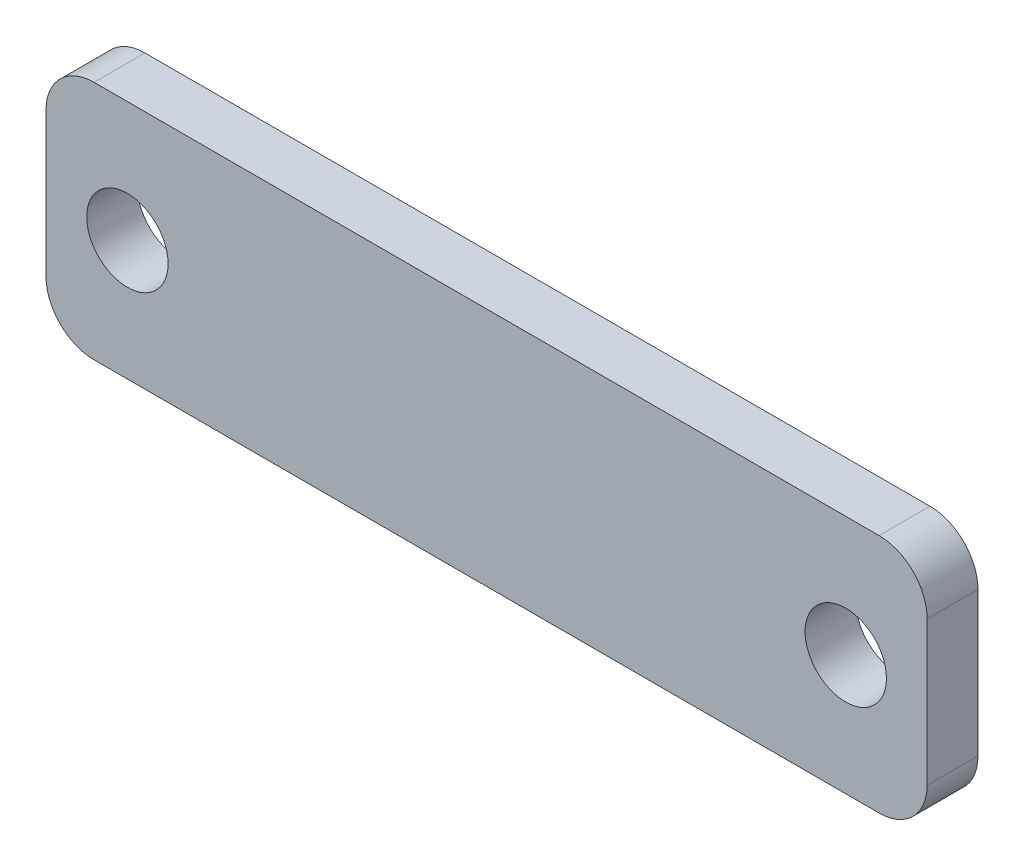
ISO-10303-21;
HEADER;
FILE_DESCRIPTION(('STEP AP214'),'2;1');
FILE_NAME('part.step','',(''),(''),'','','');
FILE_SCHEMA(('AUTOMOTIVE_DESIGN { 1 0 10303 214 1 1 1 1 }'));
ENDSEC;
DATA;
#1=APPLICATION_CONTEXT('core data for automotive mechanical design processes');
#2=APPLICATION_PROTOCOL_DEFINITION('international standard','automotive_design',2000,#1);
#3=PRODUCT_CONTEXT('',#1,'mechanical');
#4=PRODUCT('Part','Part','',(#3));
#5=PRODUCT_RELATED_PRODUCT_CATEGORY('part','',(#4));
#6=PRODUCT_DEFINITION_FORMATION('','',#4);
#7=PRODUCT_DEFINITION_CONTEXT('part definition',#1,'design');
#8=PRODUCT_DEFINITION('design','',#6,#7);
#9=PRODUCT_DEFINITION_SHAPE('','',#8);
#10=(LENGTH_UNIT() NAMED_UNIT(*) SI_UNIT(.MILLI.,.METRE.));
#11=(NAMED_UNIT(*) PLANE_ANGLE_UNIT() SI_UNIT($,.RADIAN.));
#12=(NAMED_UNIT(*) SI_UNIT($,.STERADIAN.) SOLID_ANGLE_UNIT());
#13=UNCERTAINTY_MEASURE_WITH_UNIT(LENGTH_MEASURE(1.E-05),#10,'distance_accuracy_value','');
#14=(GEOMETRIC_REPRESENTATION_CONTEXT(3) GLOBAL_UNCERTAINTY_ASSIGNED_CONTEXT((#13)) GLOBAL_UNIT_ASSIGNED_CONTEXT((#10,
#11,#12)) REPRESENTATION_CONTEXT('',''));
#15=CARTESIAN_POINT('',(0.,0.,0.));
#16=DIRECTION('',(0.,0.,1.));
#17=DIRECTION('',(1.,0.,0.));
#18=AXIS2_PLACEMENT_3D('',#15,#16,#17);
#19=CARTESIAN_POINT('',(0.,0.,-3.175));
#20=DIRECTION('',(0.,0.,-1.));
#21=DIRECTION('',(-1.,0.,0.));
#22=AXIS2_PLACEMENT_3D('',#19,#20,#21);
#23=PLANE('',#22);
#24=CARTESIAN_POINT('',(22.42,0.,-3.175));
#25=DIRECTION('',(0.,0.,1.));
#26=DIRECTION('',(1.,0.,0.));
#27=AXIS2_PLACEMENT_3D('',#24,#25,#26);
#28=CIRCLE('',#27,2.54);
#29=CARTESIAN_POINT('',(24.96,0.,-3.175));
#30=VERTEX_POINT('',#29);
#31=EDGE_CURVE('E183',#30,#30,#28,.F.);
#32=ORIENTED_EDGE('',*,*,#31,.F.);
#33=EDGE_LOOP('',(#32));
#34=FACE_BOUND('',#33,.T.);
#35=DIRECTION('',(-1.,0.,0.));
#36=VECTOR('',#35,1.);
#37=CARTESIAN_POINT('',(-27.5,7.5,-3.175));
#38=LINE('',#37,#36);
#39=CARTESIAN_POINT('',(24.5,7.5,-3.175));
#40=VERTEX_POINT('',#39);
#41=CARTESIAN_POINT('',(-24.5,7.5,-3.175));
#42=VERTEX_POINT('',#41);
#43=EDGE_CURVE('E176',#40,#42,#38,.T.);
#44=ORIENTED_EDGE('',*,*,#43,.F.);
#45=CARTESIAN_POINT('',(24.5,4.5,-3.175));
#46=DIRECTION('',(0.,0.,-1.));
#47=DIRECTION('',(-1.,0.,0.));
#48=AXIS2_PLACEMENT_3D('',#45,#46,#47);
#49=CIRCLE('',#48,3.);
#50=CARTESIAN_POINT('',(27.5,4.5,-3.175));
#51=VERTEX_POINT('',#50);
#52=EDGE_CURVE('E155',#40,#51,#49,.T.);
#53=ORIENTED_EDGE('',*,*,#52,.T.);
#54=DIRECTION('',(0.,1.,0.));
#55=VECTOR('',#54,1.);
#56=CARTESIAN_POINT('',(27.5,-7.5,-3.175));
#57=LINE('',#56,#55);
#58=CARTESIAN_POINT('',(27.5,-4.5,-3.175));
#59=VERTEX_POINT('',#58);
#60=EDGE_CURVE('E172',#59,#51,#57,.T.);
#61=ORIENTED_EDGE('',*,*,#60,.F.);
#62=CARTESIAN_POINT('',(24.5,-4.5,-3.175));
#63=DIRECTION('',(0.,0.,-1.));
#64=DIRECTION('',(-1.,0.,0.));
#65=AXIS2_PLACEMENT_3D('',#62,#63,#64);
#66=CIRCLE('',#65,3.);
#67=CARTESIAN_POINT('',(24.5,-7.5,-3.175));
#68=VERTEX_POINT('',#67);
#69=EDGE_CURVE('E132',#59,#68,#66,.T.);
#70=ORIENTED_EDGE('',*,*,#69,.T.);
#71=DIRECTION('',(1.,0.,0.));
#72=VECTOR('',#71,1.);
#73=CARTESIAN_POINT('',(-27.5,-7.5,-3.175));
#74=LINE('',#73,#72);
#75=CARTESIAN_POINT('',(-24.5,-7.5,-3.175));
#76=VERTEX_POINT('',#75);
#77=EDGE_CURVE('E133',#76,#68,#74,.T.);
#78=ORIENTED_EDGE('',*,*,#77,.F.);
#79=CARTESIAN_POINT('',(-24.5,-4.5,-3.175));
#80=DIRECTION('',(0.,0.,-1.));
#81=DIRECTION('',(-1.,0.,0.));
#82=AXIS2_PLACEMENT_3D('',#79,#80,#81);
#83=CIRCLE('',#82,3.);
#84=CARTESIAN_POINT('',(-27.5,-4.5,-3.175));
#85=VERTEX_POINT('',#84);
#86=EDGE_CURVE('E54',#76,#85,#83,.T.);
#87=ORIENTED_EDGE('',*,*,#86,.T.);
#88=DIRECTION('',(0.,-1.,0.));
#89=VECTOR('',#88,1.);
#90=CARTESIAN_POINT('',(-27.5,-7.5,-3.175));
#91=LINE('',#90,#89);
#92=CARTESIAN_POINT('',(-27.5,4.5,-3.175));
#93=VERTEX_POINT('',#92);
#94=EDGE_CURVE('E138',#93,#85,#91,.T.);
#95=ORIENTED_EDGE('',*,*,#94,.F.);
#96=CARTESIAN_POINT('',(-24.5,4.5,-3.175));
#97=DIRECTION('',(0.,0.,-1.));
#98=DIRECTION('',(-1.,0.,0.));
#99=AXIS2_PLACEMENT_3D('',#96,#97,#98);
#100=CIRCLE('',#99,3.);
#101=EDGE_CURVE('E151',#93,#42,#100,.T.);
#102=ORIENTED_EDGE('',*,*,#101,.T.);
#103=EDGE_LOOP('',(#44,#53,#61,#70,#78,#87,#95,#102));
#104=FACE_BOUND('',#103,.T.);
#105=CARTESIAN_POINT('',(-22.42,0.,-3.175));
#106=DIRECTION('',(0.,0.,1.));
#107=DIRECTION('',(1.,0.,0.));
#108=AXIS2_PLACEMENT_3D('',#105,#106,#107);
#109=CIRCLE('',#108,2.54);
#110=CARTESIAN_POINT('',(-19.88,0.,-3.175));
#111=VERTEX_POINT('',#110);
#112=EDGE_CURVE('E128',#111,#111,#109,.T.);
#113=ORIENTED_EDGE('',*,*,#112,.T.);
#114=EDGE_LOOP('',(#113));
#115=FACE_BOUND('',#114,.T.);
#116=ADVANCED_FACE('F39',(#34,#104,#115),#23,.T.);
#117=CARTESIAN_POINT('',(0.,0.,0.));
#118=DIRECTION('',(0.,0.,-1.));
#119=DIRECTION('',(-1.,0.,0.));
#120=AXIS2_PLACEMENT_3D('',#117,#118,#119);
#121=PLANE('',#120);
#122=DIRECTION('',(0.,1.,0.));
#123=VECTOR('',#122,1.);
#124=CARTESIAN_POINT('',(27.5,-7.5,0.));
#125=LINE('',#124,#123);
#126=CARTESIAN_POINT('',(27.5,-4.5,0.));
#127=VERTEX_POINT('',#126);
#128=CARTESIAN_POINT('',(27.5,4.5,0.));
#129=VERTEX_POINT('',#128);
#130=EDGE_CURVE('E109',#127,#129,#125,.T.);
#131=ORIENTED_EDGE('',*,*,#130,.T.);
#132=CARTESIAN_POINT('',(24.5,4.5,0.));
#133=DIRECTION('',(0.,0.,-1.));
#134=DIRECTION('',(-1.,0.,0.));
#135=AXIS2_PLACEMENT_3D('',#132,#133,#134);
#136=CIRCLE('',#135,3.);
#137=CARTESIAN_POINT('',(24.5,7.5,0.));
#138=VERTEX_POINT('',#137);
#139=EDGE_CURVE('E116',#129,#138,#136,.F.);
#140=ORIENTED_EDGE('',*,*,#139,.T.);
#141=DIRECTION('',(-1.,0.,0.));
#142=VECTOR('',#141,1.);
#143=CARTESIAN_POINT('',(-27.5,7.5,0.));
#144=LINE('',#143,#142);
#145=CARTESIAN_POINT('',(-24.5,7.5,0.));
#146=VERTEX_POINT('',#145);
#147=EDGE_CURVE('E127',#138,#146,#144,.T.);
#148=ORIENTED_EDGE('',*,*,#147,.T.);
#149=CARTESIAN_POINT('',(-24.5,4.5,0.));
#150=DIRECTION('',(0.,0.,-1.));
#151=DIRECTION('',(-1.,0.,0.));
#152=AXIS2_PLACEMENT_3D('',#149,#150,#151);
#153=CIRCLE('',#152,3.);
#154=CARTESIAN_POINT('',(-27.5,4.5,0.));
#155=VERTEX_POINT('',#154);
#156=EDGE_CURVE('E135',#146,#155,#153,.F.);
#157=ORIENTED_EDGE('',*,*,#156,.T.);
#158=DIRECTION('',(0.,-1.,0.));
#159=VECTOR('',#158,1.);
#160=CARTESIAN_POINT('',(-27.5,-7.5,0.));
#161=LINE('',#160,#159);
#162=CARTESIAN_POINT('',(-27.5,-4.5,0.));
#163=VERTEX_POINT('',#162);
#164=EDGE_CURVE('E170',#155,#163,#161,.T.);
#165=ORIENTED_EDGE('',*,*,#164,.T.);
#166=CARTESIAN_POINT('',(-24.5,-4.5,0.));
#167=DIRECTION('',(0.,0.,-1.));
#168=DIRECTION('',(-1.,0.,0.));
#169=AXIS2_PLACEMENT_3D('',#166,#167,#168);
#170=CIRCLE('',#169,3.);
#171=CARTESIAN_POINT('',(-24.5,-7.5,0.));
#172=VERTEX_POINT('',#171);
#173=EDGE_CURVE('E117',#163,#172,#170,.F.);
#174=ORIENTED_EDGE('',*,*,#173,.T.);
#175=DIRECTION('',(1.,0.,0.));
#176=VECTOR('',#175,1.);
#177=CARTESIAN_POINT('',(-27.5,-7.5,0.));
#178=LINE('',#177,#176);
#179=CARTESIAN_POINT('',(24.5,-7.5,0.));
#180=VERTEX_POINT('',#179);
#181=EDGE_CURVE('E111',#172,#180,#178,.T.);
#182=ORIENTED_EDGE('',*,*,#181,.T.);
#183=CARTESIAN_POINT('',(24.5,-4.5,0.));
#184=DIRECTION('',(0.,0.,-1.));
#185=DIRECTION('',(-1.,0.,0.));
#186=AXIS2_PLACEMENT_3D('',#183,#184,#185);
#187=CIRCLE('',#186,3.);
#188=EDGE_CURVE('E105',#180,#127,#187,.F.);
#189=ORIENTED_EDGE('',*,*,#188,.T.);
#190=EDGE_LOOP('',(#131,#140,#148,#157,#165,#174,#182,#189));
#191=FACE_BOUND('',#190,.T.);
#192=CARTESIAN_POINT('',(22.42,0.,0.));
#193=DIRECTION('',(0.,0.,1.));
#194=DIRECTION('',(1.,0.,0.));
#195=AXIS2_PLACEMENT_3D('',#192,#193,#194);
#196=CIRCLE('',#195,2.54);
#197=CARTESIAN_POINT('',(24.96,0.,0.));
#198=VERTEX_POINT('',#197);
#199=EDGE_CURVE('E180',#198,#198,#196,.F.);
#200=ORIENTED_EDGE('',*,*,#199,.T.);
#201=EDGE_LOOP('',(#200));
#202=FACE_BOUND('',#201,.T.);
#203=CARTESIAN_POINT('',(-22.42,0.,0.));
#204=DIRECTION('',(0.,0.,1.));
#205=DIRECTION('',(1.,0.,0.));
#206=AXIS2_PLACEMENT_3D('',#203,#204,#205);
#207=CIRCLE('',#206,2.54);
#208=CARTESIAN_POINT('',(-19.88,0.,0.));
#209=VERTEX_POINT('',#208);
#210=EDGE_CURVE('E186',#209,#209,#207,.T.);
#211=ORIENTED_EDGE('',*,*,#210,.F.);
#212=EDGE_LOOP('',(#211));
#213=FACE_BOUND('',#212,.T.);
#214=ADVANCED_FACE('F107',(#191,#202,#213),#121,.F.);
#215=CARTESIAN_POINT('',(27.5,-7.5,-3.175));
#216=DIRECTION('',(1.,0.,0.));
#217=DIRECTION('',(0.,0.,-1.));
#218=AXIS2_PLACEMENT_3D('',#215,#216,#217);
#219=PLANE('',#218);
#220=ORIENTED_EDGE('',*,*,#60,.T.);
#221=DIRECTION('',(0.,0.,1.));
#222=VECTOR('',#221,1.);
#223=CARTESIAN_POINT('',(27.5,4.5,-3.175));
#224=LINE('',#223,#222);
#225=EDGE_CURVE('E126',#51,#129,#224,.T.);
#226=ORIENTED_EDGE('',*,*,#225,.T.);
#227=ORIENTED_EDGE('',*,*,#130,.F.);
#228=DIRECTION('',(0.,0.,1.));
#229=VECTOR('',#228,1.);
#230=CARTESIAN_POINT('',(27.5,-4.5,-3.175));
#231=LINE('',#230,#229);
#232=EDGE_CURVE('E123',#127,#59,#231,.F.);
#233=ORIENTED_EDGE('',*,*,#232,.T.);
#234=EDGE_LOOP('',(#220,#226,#227,#233));
#235=FACE_BOUND('',#234,.T.);
#236=ADVANCED_FACE('F122',(#235),#219,.T.);
#237=CARTESIAN_POINT('',(-27.5,-7.5,-3.175));
#238=DIRECTION('',(0.,-1.,0.));
#239=DIRECTION('',(0.,0.,-1.));
#240=AXIS2_PLACEMENT_3D('',#237,#238,#239);
#241=PLANE('',#240);
#242=ORIENTED_EDGE('',*,*,#77,.T.);
#243=DIRECTION('',(0.,0.,1.));
#244=VECTOR('',#243,1.);
#245=CARTESIAN_POINT('',(24.5,-7.5,-3.175));
#246=LINE('',#245,#244);
#247=EDGE_CURVE('E159',#68,#180,#246,.T.);
#248=ORIENTED_EDGE('',*,*,#247,.T.);
#249=ORIENTED_EDGE('',*,*,#181,.F.);
#250=DIRECTION('',(0.,0.,1.));
#251=VECTOR('',#250,1.);
#252=CARTESIAN_POINT('',(-24.5,-7.5,-3.175));
#253=LINE('',#252,#251);
#254=EDGE_CURVE('E157',#172,#76,#253,.F.);
#255=ORIENTED_EDGE('',*,*,#254,.T.);
#256=EDGE_LOOP('',(#242,#248,#249,#255));
#257=FACE_BOUND('',#256,.T.);
#258=ADVANCED_FACE('F161',(#257),#241,.T.);
#259=CARTESIAN_POINT('',(-27.5,-7.5,-3.175));
#260=DIRECTION('',(-1.,0.,0.));
#261=DIRECTION('',(0.,0.,1.));
#262=AXIS2_PLACEMENT_3D('',#259,#260,#261);
#263=PLANE('',#262);
#264=ORIENTED_EDGE('',*,*,#94,.T.);
#265=DIRECTION('',(0.,0.,1.));
#266=VECTOR('',#265,1.);
#267=CARTESIAN_POINT('',(-27.5,-4.5,-3.175));
#268=LINE('',#267,#266);
#269=EDGE_CURVE('E11',#85,#163,#268,.T.);
#270=ORIENTED_EDGE('',*,*,#269,.T.);
#271=ORIENTED_EDGE('',*,*,#164,.F.);
#272=DIRECTION('',(0.,0.,1.));
#273=VECTOR('',#272,1.);
#274=CARTESIAN_POINT('',(-27.5,4.5,-3.175));
#275=LINE('',#274,#273);
#276=EDGE_CURVE('E47',#155,#93,#275,.F.);
#277=ORIENTED_EDGE('',*,*,#276,.T.);
#278=EDGE_LOOP('',(#264,#270,#271,#277));
#279=FACE_BOUND('',#278,.T.);
#280=ADVANCED_FACE('F169',(#279),#263,.T.);
#281=CARTESIAN_POINT('',(-27.5,7.5,-3.175));
#282=DIRECTION('',(0.,1.,0.));
#283=DIRECTION('',(0.,0.,1.));
#284=AXIS2_PLACEMENT_3D('',#281,#282,#283);
#285=PLANE('',#284);
#286=ORIENTED_EDGE('',*,*,#147,.F.);
#287=DIRECTION('',(0.,0.,1.));
#288=VECTOR('',#287,1.);
#289=CARTESIAN_POINT('',(24.5,7.5,-3.175));
#290=LINE('',#289,#288);
#291=EDGE_CURVE('E149',#138,#40,#290,.F.);
#292=ORIENTED_EDGE('',*,*,#291,.T.);
#293=ORIENTED_EDGE('',*,*,#43,.T.);
#294=DIRECTION('',(0.,0.,1.));
#295=VECTOR('',#294,1.);
#296=CARTESIAN_POINT('',(-24.5,7.5,-3.175));
#297=LINE('',#296,#295);
#298=EDGE_CURVE('E146',#42,#146,#297,.T.);
#299=ORIENTED_EDGE('',*,*,#298,.T.);
#300=EDGE_LOOP('',(#286,#292,#293,#299));
#301=FACE_BOUND('',#300,.T.);
#302=ADVANCED_FACE('F214',(#301),#285,.T.);
#303=CARTESIAN_POINT('',(24.5,4.5,-3.175));
#304=DIRECTION('',(0.,0.,1.));
#305=DIRECTION('',(1.,0.,0.));
#306=AXIS2_PLACEMENT_3D('',#303,#304,#305);
#307=CYLINDRICAL_SURFACE('',#306,3.);
#308=ORIENTED_EDGE('',*,*,#52,.F.);
#309=ORIENTED_EDGE('',*,*,#291,.F.);
#310=ORIENTED_EDGE('',*,*,#139,.F.);
#311=ORIENTED_EDGE('',*,*,#225,.F.);
#312=EDGE_LOOP('',(#308,#309,#310,#311));
#313=FACE_BOUND('',#312,.T.);
#314=ADVANCED_FACE('F216',(#313),#307,.T.);
#315=CARTESIAN_POINT('',(24.5,-4.5,-3.175));
#316=DIRECTION('',(0.,0.,1.));
#317=DIRECTION('',(1.,0.,0.));
#318=AXIS2_PLACEMENT_3D('',#315,#316,#317);
#319=CYLINDRICAL_SURFACE('',#318,3.);
#320=ORIENTED_EDGE('',*,*,#69,.F.);
#321=ORIENTED_EDGE('',*,*,#232,.F.);
#322=ORIENTED_EDGE('',*,*,#188,.F.);
#323=ORIENTED_EDGE('',*,*,#247,.F.);
#324=EDGE_LOOP('',(#320,#321,#322,#323));
#325=FACE_BOUND('',#324,.T.);
#326=ADVANCED_FACE('F131',(#325),#319,.T.);
#327=CARTESIAN_POINT('',(-24.5,-4.5,-3.175));
#328=DIRECTION('',(0.,0.,1.));
#329=DIRECTION('',(1.,0.,0.));
#330=AXIS2_PLACEMENT_3D('',#327,#328,#329);
#331=CYLINDRICAL_SURFACE('',#330,3.);
#332=ORIENTED_EDGE('',*,*,#86,.F.);
#333=ORIENTED_EDGE('',*,*,#254,.F.);
#334=ORIENTED_EDGE('',*,*,#173,.F.);
#335=ORIENTED_EDGE('',*,*,#269,.F.);
#336=EDGE_LOOP('',(#332,#333,#334,#335));
#337=FACE_BOUND('',#336,.T.);
#338=ADVANCED_FACE('F167',(#337),#331,.T.);
#339=CARTESIAN_POINT('',(-24.5,4.5,-3.175));
#340=DIRECTION('',(0.,0.,1.));
#341=DIRECTION('',(1.,0.,0.));
#342=AXIS2_PLACEMENT_3D('',#339,#340,#341);
#343=CYLINDRICAL_SURFACE('',#342,3.);
#344=ORIENTED_EDGE('',*,*,#101,.F.);
#345=ORIENTED_EDGE('',*,*,#276,.F.);
#346=ORIENTED_EDGE('',*,*,#156,.F.);
#347=ORIENTED_EDGE('',*,*,#298,.F.);
#348=EDGE_LOOP('',(#344,#345,#346,#347));
#349=FACE_BOUND('',#348,.T.);
#350=ADVANCED_FACE('F41',(#349),#343,.T.);
#351=CARTESIAN_POINT('',(22.42,0.,-3.175));
#352=DIRECTION('',(0.,0.,1.));
#353=DIRECTION('',(1.,0.,0.));
#354=AXIS2_PLACEMENT_3D('',#351,#352,#353);
#355=CYLINDRICAL_SURFACE('',#354,2.54);
#356=ORIENTED_EDGE('',*,*,#31,.T.);
#357=EDGE_LOOP('',(#356));
#358=FACE_BOUND('',#357,.T.);
#359=ORIENTED_EDGE('',*,*,#199,.F.);
#360=EDGE_LOOP('',(#359));
#361=FACE_BOUND('',#360,.T.);
#362=ADVANCED_FACE('F195',(#358,#361),#355,.F.);
#363=CARTESIAN_POINT('',(-22.42,0.,-3.175));
#364=DIRECTION('',(0.,0.,1.));
#365=DIRECTION('',(1.,0.,0.));
#366=AXIS2_PLACEMENT_3D('',#363,#364,#365);
#367=CYLINDRICAL_SURFACE('',#366,2.54);
#368=ORIENTED_EDGE('',*,*,#112,.F.);
#369=EDGE_LOOP('',(#368));
#370=FACE_BOUND('',#369,.T.);
#371=ORIENTED_EDGE('',*,*,#210,.T.);
#372=EDGE_LOOP('',(#371));
#373=FACE_BOUND('',#372,.T.);
#374=ADVANCED_FACE('F192',(#370,#373),#367,.F.);
#375=CLOSED_SHELL('',(#116,#214,#236,#258,#280,#302,#314,#326,#338,#350,#362,#374));
#376=MANIFOLD_SOLID_BREP('B2',#375);
#377=ADVANCED_BREP_SHAPE_REPRESENTATION('',(#18,#376),#14);
#378=SHAPE_DEFINITION_REPRESENTATION(#9,#377);
ENDSEC;
END-ISO-10303-21;
